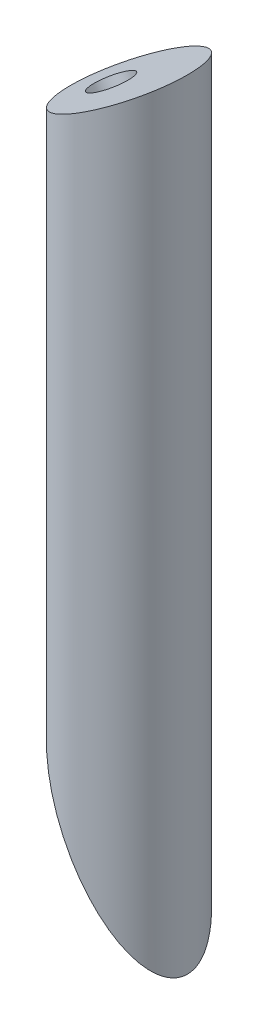
ISO-10303-21;
HEADER;
FILE_DESCRIPTION(('STEP AP214'),'2;1');
FILE_NAME('part.step','',(''),(''),'','','');
FILE_SCHEMA(('AUTOMOTIVE_DESIGN { 1 0 10303 214 1 1 1 1 }'));
ENDSEC;
DATA;
#1=APPLICATION_CONTEXT('core data for automotive mechanical design processes');
#2=APPLICATION_PROTOCOL_DEFINITION('international standard','automotive_design',2000,#1);
#3=PRODUCT_CONTEXT('',#1,'mechanical');
#4=PRODUCT('Part','Part','',(#3));
#5=PRODUCT_RELATED_PRODUCT_CATEGORY('part','',(#4));
#6=PRODUCT_DEFINITION_FORMATION('','',#4);
#7=PRODUCT_DEFINITION_CONTEXT('part definition',#1,'design');
#8=PRODUCT_DEFINITION('design','',#6,#7);
#9=PRODUCT_DEFINITION_SHAPE('','',#8);
#10=(LENGTH_UNIT() NAMED_UNIT(*) SI_UNIT(.MILLI.,.METRE.));
#11=(NAMED_UNIT(*) PLANE_ANGLE_UNIT() SI_UNIT($,.RADIAN.));
#12=(NAMED_UNIT(*) SI_UNIT($,.STERADIAN.) SOLID_ANGLE_UNIT());
#13=UNCERTAINTY_MEASURE_WITH_UNIT(LENGTH_MEASURE(1.E-05),#10,'distance_accuracy_value','');
#14=(GEOMETRIC_REPRESENTATION_CONTEXT(3) GLOBAL_UNCERTAINTY_ASSIGNED_CONTEXT((#13)) GLOBAL_UNIT_ASSIGNED_CONTEXT((#10,
#11,#12)) REPRESENTATION_CONTEXT('',''));
#15=CARTESIAN_POINT('',(0.,0.,0.));
#16=DIRECTION('',(0.,0.,1.));
#17=DIRECTION('',(1.,0.,0.));
#18=AXIS2_PLACEMENT_3D('',#15,#16,#17);
#19=CARTESIAN_POINT('',(0.,100.,0.));
#20=DIRECTION('',(0.,-1.,0.));
#21=DIRECTION('',(0.,0.,-1.));
#22=AXIS2_PLACEMENT_3D('',#19,#20,#21);
#23=CYLINDRICAL_SURFACE('',#22,7.5);
#24=CARTESIAN_POINT('',(0.,12.9903810567664,0.));
#25=DIRECTION('',(0.866025403784436,0.500000000000004,0.));
#26=DIRECTION('',(0.500000000000004,-0.866025403784436,0.));
#27=AXIS2_PLACEMENT_3D('',#24,#25,#26);
#28=ELLIPSE('',#27,14.9999999999999,7.5);
#29=CARTESIAN_POINT('',(7.5,0.,0.));
#30=VERTEX_POINT('',#29);
#31=EDGE_CURVE('E37',#30,#30,#28,.T.);
#32=ORIENTED_EDGE('',*,*,#31,.T.);
#33=EDGE_LOOP('',(#32));
#34=FACE_BOUND('',#33,.T.);
#35=CARTESIAN_POINT('',(0.,95.6698729810778,0.));
#36=DIRECTION('',(0.500000000000001,-0.866025403784438,0.));
#37=DIRECTION('',(-0.866025403784438,-0.500000000000001,0.));
#38=AXIS2_PLACEMENT_3D('',#35,#36,#37);
#39=ELLIPSE('',#38,8.66025403784439,7.5);
#40=CARTESIAN_POINT('',(-7.5,91.3397459621556,0.));
#41=VERTEX_POINT('',#40);
#42=EDGE_CURVE('E10',#41,#41,#39,.T.);
#43=ORIENTED_EDGE('',*,*,#42,.T.);
#44=EDGE_LOOP('',(#43));
#45=FACE_BOUND('',#44,.T.);
#46=ADVANCED_FACE('F31',(#34,#45),#23,.T.);
#47=CARTESIAN_POINT('',(7.5,100.,-50.));
#48=DIRECTION('',(0.500000000000001,-0.866025403784438,0.));
#49=DIRECTION('',(0.866025403784438,0.500000000000001,0.));
#50=AXIS2_PLACEMENT_3D('',#47,#48,#49);
#51=PLANE('',#50);
#52=CARTESIAN_POINT('',(-2.30384757729338,94.3397459621556,0.));
#53=DIRECTION('',(-0.500000000000001,0.866025403784438,0.));
#54=DIRECTION('',(-0.866025403784438,-0.500000000000001,0.));
#55=AXIS2_PLACEMENT_3D('',#52,#53,#54);
#56=CIRCLE('',#55,2.5);
#57=CARTESIAN_POINT('',(-4.46891108675448,93.0897459621556,0.));
#58=VERTEX_POINT('',#57);
#59=EDGE_CURVE('E45',#58,#58,#56,.T.);
#60=ORIENTED_EDGE('',*,*,#59,.F.);
#61=EDGE_LOOP('',(#60));
#62=FACE_BOUND('',#61,.T.);
#63=ORIENTED_EDGE('',*,*,#42,.F.);
#64=EDGE_LOOP('',(#63));
#65=FACE_BOUND('',#64,.T.);
#66=ADVANCED_FACE('F70',(#62,#65),#51,.F.);
#67=CARTESIAN_POINT('',(7.5,0.,-50.));
#68=DIRECTION('',(0.866025403784436,0.500000000000004,0.));
#69=DIRECTION('',(-0.500000000000004,0.866025403784436,0.));
#70=AXIS2_PLACEMENT_3D('',#67,#68,#69);
#71=PLANE('',#70);
#72=CARTESIAN_POINT('',(-3.49999999999997,19.0525588832574,0.));
#73=DIRECTION('',(-0.866025403784436,-0.500000000000005,0.));
#74=DIRECTION('',(0.500000000000004,-0.866025403784436,0.));
#75=AXIS2_PLACEMENT_3D('',#72,#73,#74);
#76=CIRCLE('',#75,2.5);
#77=CARTESIAN_POINT('',(-2.24999999999996,16.8874953737963,0.));
#78=VERTEX_POINT('',#77);
#79=EDGE_CURVE('E51',#78,#78,#76,.T.);
#80=ORIENTED_EDGE('',*,*,#79,.F.);
#81=EDGE_LOOP('',(#80));
#82=FACE_BOUND('',#81,.T.);
#83=ORIENTED_EDGE('',*,*,#31,.F.);
#84=EDGE_LOOP('',(#83));
#85=FACE_BOUND('',#84,.T.);
#86=ADVANCED_FACE('F66',(#82,#85),#71,.F.);
#87=CARTESIAN_POINT('',(2.69615242270664,85.6794919243112,0.));
#88=DIRECTION('',(-0.500000000000001,0.866025403784438,0.));
#89=DIRECTION('',(-0.866025403784438,-0.500000000000001,0.));
#90=AXIS2_PLACEMENT_3D('',#87,#88,#89);
#91=CYLINDRICAL_SURFACE('',#90,2.5);
#92=CARTESIAN_POINT('',(2.69615242270664,85.6794919243112,0.));
#93=DIRECTION('',(-0.500000000000001,0.866025403784438,0.));
#94=DIRECTION('',(-0.866025403784438,-0.500000000000001,0.));
#95=AXIS2_PLACEMENT_3D('',#92,#93,#94);
#96=CIRCLE('',#95,2.5);
#97=CARTESIAN_POINT('',(0.531088913245538,84.4294919243112,0.));
#98=VERTEX_POINT('',#97);
#99=EDGE_CURVE('E41',#98,#98,#96,.T.);
#100=ORIENTED_EDGE('',*,*,#99,.F.);
#101=EDGE_LOOP('',(#100));
#102=FACE_BOUND('',#101,.T.);
#103=ORIENTED_EDGE('',*,*,#59,.T.);
#104=EDGE_LOOP('',(#103));
#105=FACE_BOUND('',#104,.T.);
#106=ADVANCED_FACE('F69',(#102,#105),#91,.F.);
#107=CARTESIAN_POINT('',(2.69615242270664,85.6794919243112,0.));
#108=DIRECTION('',(-0.500000000000001,0.866025403784438,0.));
#109=DIRECTION('',(-0.866025403784438,-0.500000000000001,0.));
#110=AXIS2_PLACEMENT_3D('',#107,#108,#109);
#111=PLANE('',#110);
#112=ORIENTED_EDGE('',*,*,#99,.T.);
#113=EDGE_LOOP('',(#112));
#114=FACE_BOUND('',#113,.T.);
#115=ADVANCED_FACE('F62',(#114),#111,.T.);
#116=CARTESIAN_POINT('',(2.56217782649108,22.5525588832574,0.));
#117=DIRECTION('',(-0.866025403784436,-0.500000000000004,0.));
#118=DIRECTION('',(0.500000000000004,-0.866025403784436,0.));
#119=AXIS2_PLACEMENT_3D('',#116,#117,#118);
#120=CYLINDRICAL_SURFACE('',#119,2.5);
#121=CARTESIAN_POINT('',(2.56217782649108,22.5525588832574,0.));
#122=DIRECTION('',(-0.866025403784436,-0.500000000000005,0.));
#123=DIRECTION('',(0.500000000000004,-0.866025403784436,0.));
#124=AXIS2_PLACEMENT_3D('',#121,#122,#123);
#125=CIRCLE('',#124,2.5);
#126=CARTESIAN_POINT('',(3.81217782649109,20.3874953737963,0.));
#127=VERTEX_POINT('',#126);
#128=EDGE_CURVE('E49',#127,#127,#125,.T.);
#129=ORIENTED_EDGE('',*,*,#128,.F.);
#130=EDGE_LOOP('',(#129));
#131=FACE_BOUND('',#130,.T.);
#132=ORIENTED_EDGE('',*,*,#79,.T.);
#133=EDGE_LOOP('',(#132));
#134=FACE_BOUND('',#133,.T.);
#135=ADVANCED_FACE('F59',(#131,#134),#120,.F.);
#136=CARTESIAN_POINT('',(2.56217782649108,22.5525588832574,0.));
#137=DIRECTION('',(-0.866025403784436,-0.500000000000005,0.));
#138=DIRECTION('',(0.500000000000004,-0.866025403784436,0.));
#139=AXIS2_PLACEMENT_3D('',#136,#137,#138);
#140=PLANE('',#139);
#141=ORIENTED_EDGE('',*,*,#128,.T.);
#142=EDGE_LOOP('',(#141));
#143=FACE_BOUND('',#142,.T.);
#144=ADVANCED_FACE('F57',(#143),#140,.T.);
#145=CLOSED_SHELL('',(#46,#66,#86,#106,#115,#135,#144));
#146=MANIFOLD_SOLID_BREP('B2',#145);
#147=ADVANCED_BREP_SHAPE_REPRESENTATION('',(#18,#146),#14);
#148=SHAPE_DEFINITION_REPRESENTATION(#9,#147);
ENDSEC;
END-ISO-10303-21;
